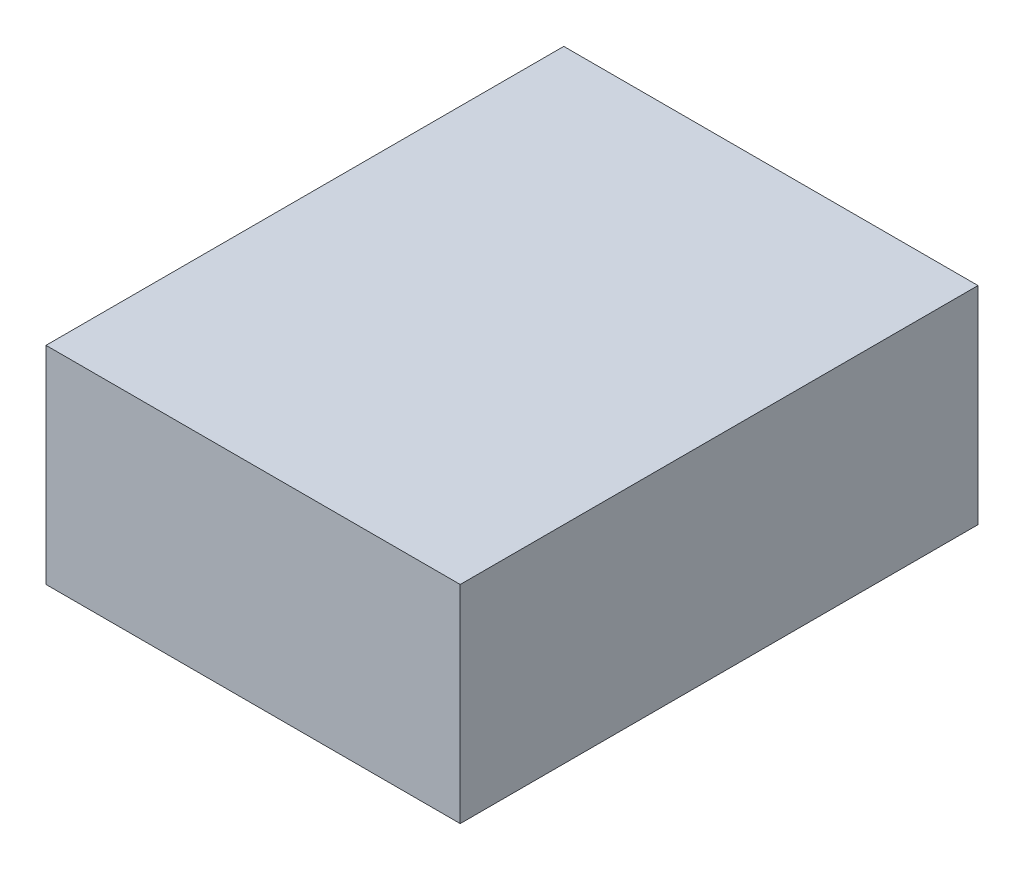
ISO-10303-21;
HEADER;
FILE_DESCRIPTION(('STEP AP214'),'2;1');
FILE_NAME('part.step','',(''),(''),'','','');
FILE_SCHEMA(('AUTOMOTIVE_DESIGN { 1 0 10303 214 1 1 1 1 }'));
ENDSEC;
DATA;
#1=APPLICATION_CONTEXT('core data for automotive mechanical design processes');
#2=APPLICATION_PROTOCOL_DEFINITION('international standard','automotive_design',2000,#1);
#3=PRODUCT_CONTEXT('',#1,'mechanical');
#4=PRODUCT('Part','Part','',(#3));
#5=PRODUCT_RELATED_PRODUCT_CATEGORY('part','',(#4));
#6=PRODUCT_DEFINITION_FORMATION('','',#4);
#7=PRODUCT_DEFINITION_CONTEXT('part definition',#1,'design');
#8=PRODUCT_DEFINITION('design','',#6,#7);
#9=PRODUCT_DEFINITION_SHAPE('','',#8);
#10=(LENGTH_UNIT() NAMED_UNIT(*) SI_UNIT(.MILLI.,.METRE.));
#11=(NAMED_UNIT(*) PLANE_ANGLE_UNIT() SI_UNIT($,.RADIAN.));
#12=(NAMED_UNIT(*) SI_UNIT($,.STERADIAN.) SOLID_ANGLE_UNIT());
#13=UNCERTAINTY_MEASURE_WITH_UNIT(LENGTH_MEASURE(1.E-05),#10,'distance_accuracy_value','');
#14=(GEOMETRIC_REPRESENTATION_CONTEXT(3) GLOBAL_UNCERTAINTY_ASSIGNED_CONTEXT((#13)) GLOBAL_UNIT_ASSIGNED_CONTEXT((#10,
#11,#12)) REPRESENTATION_CONTEXT('',''));
#15=CARTESIAN_POINT('',(0.,0.,0.));
#16=DIRECTION('',(0.,0.,1.));
#17=DIRECTION('',(1.,0.,0.));
#18=AXIS2_PLACEMENT_3D('',#15,#16,#17);
#19=CARTESIAN_POINT('',(0.,0.,0.));
#20=DIRECTION('',(0.,1.,0.));
#21=DIRECTION('',(0.,0.,1.));
#22=AXIS2_PLACEMENT_3D('',#19,#20,#21);
#23=PLANE('',#22);
#24=DIRECTION('',(-1.,0.,0.));
#25=VECTOR('',#24,1.);
#26=CARTESIAN_POINT('',(-1.,0.,1.25));
#27=LINE('',#26,#25);
#28=CARTESIAN_POINT('',(1.,0.,1.25));
#29=VERTEX_POINT('',#28);
#30=CARTESIAN_POINT('',(-1.,0.,1.25));
#31=VERTEX_POINT('',#30);
#32=EDGE_CURVE('E81',#29,#31,#27,.T.);
#33=ORIENTED_EDGE('',*,*,#32,.T.);
#34=DIRECTION('',(0.,0.,-1.));
#35=VECTOR('',#34,1.);
#36=CARTESIAN_POINT('',(-1.,0.,-1.25));
#37=LINE('',#36,#35);
#38=CARTESIAN_POINT('',(-1.,0.,-1.25));
#39=VERTEX_POINT('',#38);
#40=EDGE_CURVE('E68',#31,#39,#37,.T.);
#41=ORIENTED_EDGE('',*,*,#40,.T.);
#42=DIRECTION('',(1.,0.,0.));
#43=VECTOR('',#42,1.);
#44=CARTESIAN_POINT('',(-1.,0.,-1.25));
#45=LINE('',#44,#43);
#46=CARTESIAN_POINT('',(1.,0.,-1.25));
#47=VERTEX_POINT('',#46);
#48=EDGE_CURVE('E55',#39,#47,#45,.T.);
#49=ORIENTED_EDGE('',*,*,#48,.T.);
#50=DIRECTION('',(0.,0.,1.));
#51=VECTOR('',#50,1.);
#52=CARTESIAN_POINT('',(1.,0.,-1.25));
#53=LINE('',#52,#51);
#54=EDGE_CURVE('E20',#47,#29,#53,.T.);
#55=ORIENTED_EDGE('',*,*,#54,.T.);
#56=EDGE_LOOP('',(#33,#41,#49,#55));
#57=FACE_BOUND('',#56,.T.);
#58=ADVANCED_FACE('F17',(#57),#23,.F.);
#59=CARTESIAN_POINT('',(1.,1.,-1.25));
#60=DIRECTION('',(-1.,0.,0.));
#61=DIRECTION('',(0.,0.,1.));
#62=AXIS2_PLACEMENT_3D('',#59,#60,#61);
#63=PLANE('',#62);
#64=DIRECTION('',(0.,1.,0.));
#65=VECTOR('',#64,1.);
#66=CARTESIAN_POINT('',(1.,1.,-1.25));
#67=LINE('',#66,#65);
#68=CARTESIAN_POINT('',(1.,1.,-1.25));
#69=VERTEX_POINT('',#68);
#70=EDGE_CURVE('E61',#47,#69,#67,.T.);
#71=ORIENTED_EDGE('',*,*,#70,.T.);
#72=DIRECTION('',(0.,0.,1.));
#73=VECTOR('',#72,1.);
#74=CARTESIAN_POINT('',(1.,1.,0.));
#75=LINE('',#74,#73);
#76=CARTESIAN_POINT('',(1.,1.,1.25));
#77=VERTEX_POINT('',#76);
#78=EDGE_CURVE('E83',#77,#69,#75,.F.);
#79=ORIENTED_EDGE('',*,*,#78,.F.);
#80=DIRECTION('',(0.,1.,0.));
#81=VECTOR('',#80,1.);
#82=CARTESIAN_POINT('',(1.,1.,1.25));
#83=LINE('',#82,#81);
#84=EDGE_CURVE('E64',#77,#29,#83,.F.);
#85=ORIENTED_EDGE('',*,*,#84,.T.);
#86=ORIENTED_EDGE('',*,*,#54,.F.);
#87=EDGE_LOOP('',(#71,#79,#85,#86));
#88=FACE_BOUND('',#87,.T.);
#89=ADVANCED_FACE('F60',(#88),#63,.F.);
#90=CARTESIAN_POINT('',(-1.,1.,-1.25));
#91=DIRECTION('',(0.,0.,1.));
#92=DIRECTION('',(1.,0.,0.));
#93=AXIS2_PLACEMENT_3D('',#90,#91,#92);
#94=PLANE('',#93);
#95=DIRECTION('',(0.,1.,0.));
#96=VECTOR('',#95,1.);
#97=CARTESIAN_POINT('',(-1.,1.,-1.25));
#98=LINE('',#97,#96);
#99=CARTESIAN_POINT('',(-1.,1.,-1.25));
#100=VERTEX_POINT('',#99);
#101=EDGE_CURVE('E70',#39,#100,#98,.T.);
#102=ORIENTED_EDGE('',*,*,#101,.T.);
#103=DIRECTION('',(1.,0.,0.));
#104=VECTOR('',#103,1.);
#105=CARTESIAN_POINT('',(0.,1.,-1.25));
#106=LINE('',#105,#104);
#107=EDGE_CURVE('E74',#69,#100,#106,.F.);
#108=ORIENTED_EDGE('',*,*,#107,.F.);
#109=ORIENTED_EDGE('',*,*,#70,.F.);
#110=ORIENTED_EDGE('',*,*,#48,.F.);
#111=EDGE_LOOP('',(#102,#108,#109,#110));
#112=FACE_BOUND('',#111,.T.);
#113=ADVANCED_FACE('F72',(#112),#94,.F.);
#114=CARTESIAN_POINT('',(-1.,1.,-1.25));
#115=DIRECTION('',(1.,0.,0.));
#116=DIRECTION('',(0.,0.,-1.));
#117=AXIS2_PLACEMENT_3D('',#114,#115,#116);
#118=PLANE('',#117);
#119=DIRECTION('',(0.,1.,0.));
#120=VECTOR('',#119,1.);
#121=CARTESIAN_POINT('',(-1.,1.,1.25));
#122=LINE('',#121,#120);
#123=CARTESIAN_POINT('',(-1.,1.,1.25));
#124=VERTEX_POINT('',#123);
#125=EDGE_CURVE('E35',#31,#124,#122,.T.);
#126=ORIENTED_EDGE('',*,*,#125,.T.);
#127=DIRECTION('',(0.,0.,1.));
#128=VECTOR('',#127,1.);
#129=CARTESIAN_POINT('',(-1.,1.,0.));
#130=LINE('',#129,#128);
#131=EDGE_CURVE('E26',#100,#124,#130,.T.);
#132=ORIENTED_EDGE('',*,*,#131,.F.);
#133=ORIENTED_EDGE('',*,*,#101,.F.);
#134=ORIENTED_EDGE('',*,*,#40,.F.);
#135=EDGE_LOOP('',(#126,#132,#133,#134));
#136=FACE_BOUND('',#135,.T.);
#137=ADVANCED_FACE('F89',(#136),#118,.F.);
#138=CARTESIAN_POINT('',(-1.,1.,1.25));
#139=DIRECTION('',(0.,0.,-1.));
#140=DIRECTION('',(-1.,0.,0.));
#141=AXIS2_PLACEMENT_3D('',#138,#139,#140);
#142=PLANE('',#141);
#143=ORIENTED_EDGE('',*,*,#84,.F.);
#144=DIRECTION('',(1.,0.,0.));
#145=VECTOR('',#144,1.);
#146=CARTESIAN_POINT('',(0.,1.,1.25));
#147=LINE('',#146,#145);
#148=EDGE_CURVE('E11',#124,#77,#147,.T.);
#149=ORIENTED_EDGE('',*,*,#148,.F.);
#150=ORIENTED_EDGE('',*,*,#125,.F.);
#151=ORIENTED_EDGE('',*,*,#32,.F.);
#152=EDGE_LOOP('',(#143,#149,#150,#151));
#153=FACE_BOUND('',#152,.T.);
#154=ADVANCED_FACE('F91',(#153),#142,.F.);
#155=CARTESIAN_POINT('',(0.,1.,0.));
#156=DIRECTION('',(0.,1.,0.));
#157=DIRECTION('',(0.,0.,1.));
#158=AXIS2_PLACEMENT_3D('',#155,#156,#157);
#159=PLANE('',#158);
#160=ORIENTED_EDGE('',*,*,#131,.T.);
#161=ORIENTED_EDGE('',*,*,#148,.T.);
#162=ORIENTED_EDGE('',*,*,#78,.T.);
#163=ORIENTED_EDGE('',*,*,#107,.T.);
#164=EDGE_LOOP('',(#160,#161,#162,#163));
#165=FACE_BOUND('',#164,.T.);
#166=ADVANCED_FACE('F88',(#165),#159,.T.);
#167=CLOSED_SHELL('',(#58,#89,#113,#137,#154,#166));
#168=MANIFOLD_SOLID_BREP('B1',#167);
#169=ADVANCED_BREP_SHAPE_REPRESENTATION('',(#18,#168),#14);
#170=SHAPE_DEFINITION_REPRESENTATION(#9,#169);
ENDSEC;
END-ISO-10303-21;
